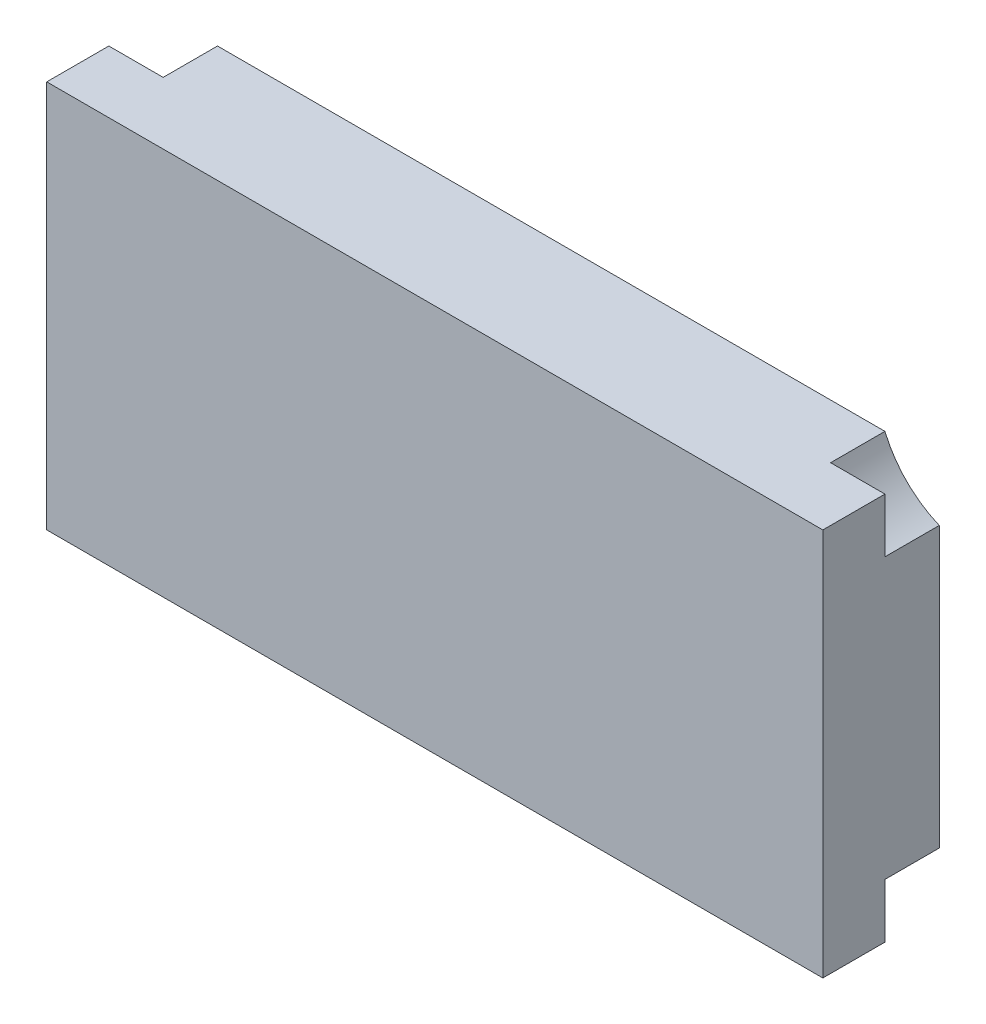
ISO-10303-21;
HEADER;
FILE_DESCRIPTION(('STEP AP214'),'2;1');
FILE_NAME('part.step','',(''),(''),'','','');
FILE_SCHEMA(('AUTOMOTIVE_DESIGN { 1 0 10303 214 1 1 1 1 }'));
ENDSEC;
DATA;
#1=APPLICATION_CONTEXT('core data for automotive mechanical design processes');
#2=APPLICATION_PROTOCOL_DEFINITION('international standard','automotive_design',2000,#1);
#3=PRODUCT_CONTEXT('',#1,'mechanical');
#4=PRODUCT('Part','Part','',(#3));
#5=PRODUCT_RELATED_PRODUCT_CATEGORY('part','',(#4));
#6=PRODUCT_DEFINITION_FORMATION('','',#4);
#7=PRODUCT_DEFINITION_CONTEXT('part definition',#1,'design');
#8=PRODUCT_DEFINITION('design','',#6,#7);
#9=PRODUCT_DEFINITION_SHAPE('','',#8);
#10=(LENGTH_UNIT() NAMED_UNIT(*) SI_UNIT(.MILLI.,.METRE.));
#11=(NAMED_UNIT(*) PLANE_ANGLE_UNIT() SI_UNIT($,.RADIAN.));
#12=(NAMED_UNIT(*) SI_UNIT($,.STERADIAN.) SOLID_ANGLE_UNIT());
#13=UNCERTAINTY_MEASURE_WITH_UNIT(LENGTH_MEASURE(1.E-05),#10,'distance_accuracy_value','');
#14=(GEOMETRIC_REPRESENTATION_CONTEXT(3) GLOBAL_UNCERTAINTY_ASSIGNED_CONTEXT((#13)) GLOBAL_UNIT_ASSIGNED_CONTEXT((#10,
#11,#12)) REPRESENTATION_CONTEXT('',''));
#15=CARTESIAN_POINT('',(0.,0.,0.));
#16=DIRECTION('',(0.,0.,1.));
#17=DIRECTION('',(1.,0.,0.));
#18=AXIS2_PLACEMENT_3D('',#15,#16,#17);
#19=CARTESIAN_POINT('',(-0.55,-0.3,0.07));
#20=DIRECTION('',(0.,0.,-1.));
#21=DIRECTION('',(-1.,0.,0.));
#22=AXIS2_PLACEMENT_3D('',#19,#20,#21);
#23=CYLINDRICAL_SURFACE('',#22,0.13);
#24=CARTESIAN_POINT('',(-0.55,-0.3,0.));
#25=DIRECTION('',(0.,0.,-1.));
#26=DIRECTION('',(-1.,0.,0.));
#27=AXIS2_PLACEMENT_3D('',#24,#25,#26);
#28=CIRCLE('',#27,0.13);
#29=CARTESIAN_POINT('',(-0.5,-0.179999999994,0.));
#30=VERTEX_POINT('',#29);
#31=CARTESIAN_POINT('',(-0.43,-0.25,0.));
#32=VERTEX_POINT('',#31);
#33=EDGE_CURVE('E142',#30,#32,#28,.T.);
#34=ORIENTED_EDGE('',*,*,#33,.T.);
#35=DIRECTION('',(0.,0.,1.));
#36=VECTOR('',#35,1.);
#37=CARTESIAN_POINT('',(-0.43,-0.25,0.));
#38=LINE('',#37,#36);
#39=CARTESIAN_POINT('',(-0.43,-0.25,0.0700000000125));
#40=VERTEX_POINT('',#39);
#41=EDGE_CURVE('E110',#32,#40,#38,.T.);
#42=ORIENTED_EDGE('',*,*,#41,.T.);
#43=CARTESIAN_POINT('',(-0.55,-0.3,0.07));
#44=DIRECTION('',(0.,0.,-1.));
#45=DIRECTION('',(-1.,0.,0.));
#46=AXIS2_PLACEMENT_3D('',#43,#44,#45);
#47=CIRCLE('',#46,0.13);
#48=CARTESIAN_POINT('',(-0.5,-0.179999999994,0.070000000025));
#49=VERTEX_POINT('',#48);
#50=EDGE_CURVE('E20',#49,#40,#47,.T.);
#51=ORIENTED_EDGE('',*,*,#50,.F.);
#52=DIRECTION('',(0.,0.,-1.));
#53=VECTOR('',#52,1.);
#54=CARTESIAN_POINT('',(-0.5,-0.179999999988,0.));
#55=LINE('',#54,#53);
#56=EDGE_CURVE('E107',#49,#30,#55,.T.);
#57=ORIENTED_EDGE('',*,*,#56,.T.);
#58=EDGE_LOOP('',(#34,#42,#51,#57));
#59=FACE_BOUND('',#58,.T.);
#60=ADVANCED_FACE('F17',(#59),#23,.F.);
#61=CARTESIAN_POINT('',(-0.42958,-0.25,0.07));
#62=DIRECTION('',(0.,0.,-1.));
#63=DIRECTION('',(-1.,0.,0.));
#64=AXIS2_PLACEMENT_3D('',#61,#62,#63);
#65=PLANE('',#64);
#66=DIRECTION('',(0.,1.,0.));
#67=VECTOR('',#66,1.);
#68=CARTESIAN_POINT('',(-0.5,-0.25,0.07000000005));
#69=LINE('',#68,#67);
#70=CARTESIAN_POINT('',(-0.5,-0.25,0.0700000000291667));
#71=VERTEX_POINT('',#70);
#72=EDGE_CURVE('E115',#71,#49,#69,.T.);
#73=ORIENTED_EDGE('',*,*,#72,.T.);
#74=ORIENTED_EDGE('',*,*,#50,.T.);
#75=DIRECTION('',(1.,0.,0.));
#76=VECTOR('',#75,1.);
#77=CARTESIAN_POINT('',(-0.5,-0.25,0.070000000025));
#78=LINE('',#77,#76);
#79=EDGE_CURVE('E117',#40,#71,#78,.F.);
#80=ORIENTED_EDGE('',*,*,#79,.T.);
#81=EDGE_LOOP('',(#73,#74,#80));
#82=FACE_BOUND('',#81,.T.);
#83=ADVANCED_FACE('F116',(#82),#65,.T.);
#84=CARTESIAN_POINT('',(0.5,-0.25,0.07));
#85=DIRECTION('',(0.,0.,-1.));
#86=DIRECTION('',(-1.,0.,0.));
#87=AXIS2_PLACEMENT_3D('',#84,#85,#86);
#88=PLANE('',#87);
#89=CARTESIAN_POINT('',(0.55,-0.3,0.07));
#90=DIRECTION('',(0.,0.,-1.));
#91=DIRECTION('',(-1.,0.,0.));
#92=AXIS2_PLACEMENT_3D('',#89,#90,#91);
#93=CIRCLE('',#92,0.13);
#94=CARTESIAN_POINT('',(0.430000000004,-0.25,0.0700000000125));
#95=VERTEX_POINT('',#94);
#96=CARTESIAN_POINT('',(0.5,-0.18,0.0700000000125));
#97=VERTEX_POINT('',#96);
#98=EDGE_CURVE('E113',#95,#97,#93,.T.);
#99=ORIENTED_EDGE('',*,*,#98,.T.);
#100=DIRECTION('',(0.,1.,0.));
#101=VECTOR('',#100,1.);
#102=CARTESIAN_POINT('',(0.5,-0.25,0.070000000025));
#103=LINE('',#102,#101);
#104=CARTESIAN_POINT('',(0.5,-0.25,0.0700000000208333));
#105=VERTEX_POINT('',#104);
#106=EDGE_CURVE('E152',#97,#105,#103,.F.);
#107=ORIENTED_EDGE('',*,*,#106,.T.);
#108=DIRECTION('',(1.,0.,0.));
#109=VECTOR('',#108,1.);
#110=CARTESIAN_POINT('',(-0.5,-0.25,0.070000000025));
#111=LINE('',#110,#109);
#112=EDGE_CURVE('E154',#105,#95,#111,.F.);
#113=ORIENTED_EDGE('',*,*,#112,.T.);
#114=EDGE_LOOP('',(#99,#107,#113));
#115=FACE_BOUND('',#114,.T.);
#116=ADVANCED_FACE('F150',(#115),#88,.T.);
#117=CARTESIAN_POINT('',(0.55,-0.3,0.07));
#118=DIRECTION('',(0.,0.,-1.));
#119=DIRECTION('',(-1.,0.,0.));
#120=AXIS2_PLACEMENT_3D('',#117,#118,#119);
#121=CYLINDRICAL_SURFACE('',#120,0.13);
#122=CARTESIAN_POINT('',(0.55,-0.3,0.));
#123=DIRECTION('',(0.,0.,-1.));
#124=DIRECTION('',(-1.,0.,0.));
#125=AXIS2_PLACEMENT_3D('',#122,#123,#124);
#126=CIRCLE('',#125,0.13);
#127=CARTESIAN_POINT('',(0.430000000004,-0.25,0.));
#128=VERTEX_POINT('',#127);
#129=CARTESIAN_POINT('',(0.5,-0.18,0.));
#130=VERTEX_POINT('',#129);
#131=EDGE_CURVE('E140',#128,#130,#126,.T.);
#132=ORIENTED_EDGE('',*,*,#131,.T.);
#133=DIRECTION('',(0.,0.,1.));
#134=VECTOR('',#133,1.);
#135=CARTESIAN_POINT('',(0.5,-0.18,0.));
#136=LINE('',#135,#134);
#137=EDGE_CURVE('E159',#130,#97,#136,.T.);
#138=ORIENTED_EDGE('',*,*,#137,.T.);
#139=ORIENTED_EDGE('',*,*,#98,.F.);
#140=DIRECTION('',(0.,0.,1.));
#141=VECTOR('',#140,1.);
#142=CARTESIAN_POINT('',(0.430000000008,-0.25,0.));
#143=LINE('',#142,#141);
#144=EDGE_CURVE('E169',#95,#128,#143,.F.);
#145=ORIENTED_EDGE('',*,*,#144,.T.);
#146=EDGE_LOOP('',(#132,#138,#139,#145));
#147=FACE_BOUND('',#146,.T.);
#148=ADVANCED_FACE('F160',(#147),#121,.F.);
#149=CARTESIAN_POINT('',(0.5,0.17958,0.07));
#150=DIRECTION('',(0.,0.,-1.));
#151=DIRECTION('',(-1.,0.,0.));
#152=AXIS2_PLACEMENT_3D('',#149,#150,#151);
#153=PLANE('',#152);
#154=DIRECTION('',(0.,1.,0.));
#155=VECTOR('',#154,1.);
#156=CARTESIAN_POINT('',(0.5,-0.25,0.070000000025));
#157=LINE('',#156,#155);
#158=CARTESIAN_POINT('',(0.5,0.249999999995167,0.0700000000083334));
#159=VERTEX_POINT('',#158);
#160=CARTESIAN_POINT('',(0.5,0.18,0.070000000025));
#161=VERTEX_POINT('',#160);
#162=EDGE_CURVE('E171',#159,#161,#157,.F.);
#163=ORIENTED_EDGE('',*,*,#162,.T.);
#164=CARTESIAN_POINT('',(0.55,0.3,0.070000000025));
#165=DIRECTION('',(0.,0.,-1.));
#166=DIRECTION('',(-1.,0.,0.));
#167=AXIS2_PLACEMENT_3D('',#164,#165,#166);
#168=CIRCLE('',#167,0.13);
#169=CARTESIAN_POINT('',(0.430000000006,0.25,0.0700000000125));
#170=VERTEX_POINT('',#169);
#171=EDGE_CURVE('E138',#161,#170,#168,.T.);
#172=ORIENTED_EDGE('',*,*,#171,.T.);
#173=DIRECTION('',(1.,0.,0.));
#174=VECTOR('',#173,1.);
#175=CARTESIAN_POINT('',(-0.5,0.25,0.07));
#176=LINE('',#175,#174);
#177=EDGE_CURVE('E163',#170,#159,#176,.T.);
#178=ORIENTED_EDGE('',*,*,#177,.T.);
#179=EDGE_LOOP('',(#163,#172,#178));
#180=FACE_BOUND('',#179,.T.);
#181=ADVANCED_FACE('F239',(#180),#153,.T.);
#182=CARTESIAN_POINT('',(-0.42958,0.17958,0.07));
#183=DIRECTION('',(0.,0.,-1.));
#184=DIRECTION('',(-1.,0.,0.));
#185=AXIS2_PLACEMENT_3D('',#182,#183,#184);
#186=PLANE('',#185);
#187=DIRECTION('',(1.,0.,0.));
#188=VECTOR('',#187,1.);
#189=CARTESIAN_POINT('',(-0.5,0.25,0.07000000004167));
#190=LINE('',#189,#188);
#191=CARTESIAN_POINT('',(-0.5,0.25,0.0700000000291683));
#192=VERTEX_POINT('',#191);
#193=CARTESIAN_POINT('',(-0.43,0.25,0.070000000033335));
#194=VERTEX_POINT('',#193);
#195=EDGE_CURVE('E248',#192,#194,#190,.T.);
#196=ORIENTED_EDGE('',*,*,#195,.T.);
#197=CARTESIAN_POINT('',(-0.55,0.3,0.070000000025));
#198=DIRECTION('',(0.,0.,-1.));
#199=DIRECTION('',(-1.,0.,0.));
#200=AXIS2_PLACEMENT_3D('',#197,#198,#199);
#201=CIRCLE('',#200,0.13);
#202=CARTESIAN_POINT('',(-0.5,0.18,0.070000000025));
#203=VERTEX_POINT('',#202);
#204=EDGE_CURVE('E146',#194,#203,#201,.T.);
#205=ORIENTED_EDGE('',*,*,#204,.T.);
#206=DIRECTION('',(0.,1.,0.));
#207=VECTOR('',#206,1.);
#208=CARTESIAN_POINT('',(-0.5,-0.25,0.070000000025));
#209=LINE('',#208,#207);
#210=EDGE_CURVE('E120',#203,#192,#209,.T.);
#211=ORIENTED_EDGE('',*,*,#210,.T.);
#212=EDGE_LOOP('',(#196,#205,#211));
#213=FACE_BOUND('',#212,.T.);
#214=ADVANCED_FACE('F257',(#213),#186,.T.);
#215=CARTESIAN_POINT('',(-0.55,0.3,0.07));
#216=DIRECTION('',(0.,0.,-1.));
#217=DIRECTION('',(-1.,0.,0.));
#218=AXIS2_PLACEMENT_3D('',#215,#216,#217);
#219=CYLINDRICAL_SURFACE('',#218,0.13);
#220=CARTESIAN_POINT('',(-0.55,0.3,0.));
#221=DIRECTION('',(0.,0.,-1.));
#222=DIRECTION('',(-1.,0.,0.));
#223=AXIS2_PLACEMENT_3D('',#220,#221,#222);
#224=CIRCLE('',#223,0.13);
#225=CARTESIAN_POINT('',(-0.43,0.25,0.));
#226=VERTEX_POINT('',#225);
#227=CARTESIAN_POINT('',(-0.5,0.18,0.));
#228=VERTEX_POINT('',#227);
#229=EDGE_CURVE('E144',#226,#228,#224,.T.);
#230=ORIENTED_EDGE('',*,*,#229,.T.);
#231=DIRECTION('',(0.,0.,-1.));
#232=VECTOR('',#231,1.);
#233=CARTESIAN_POINT('',(-0.5,0.18,0.));
#234=LINE('',#233,#232);
#235=EDGE_CURVE('E132',#228,#203,#234,.F.);
#236=ORIENTED_EDGE('',*,*,#235,.T.);
#237=ORIENTED_EDGE('',*,*,#204,.F.);
#238=DIRECTION('',(0.,0.,-1.));
#239=VECTOR('',#238,1.);
#240=CARTESIAN_POINT('',(-0.43,0.25,0.15));
#241=LINE('',#240,#239);
#242=EDGE_CURVE('E246',#194,#226,#241,.T.);
#243=ORIENTED_EDGE('',*,*,#242,.T.);
#244=EDGE_LOOP('',(#230,#236,#237,#243));
#245=FACE_BOUND('',#244,.T.);
#246=ADVANCED_FACE('F262',(#245),#219,.F.);
#247=CARTESIAN_POINT('',(-0.5,-0.25,0.));
#248=DIRECTION('',(0.,0.,1.));
#249=DIRECTION('',(1.,0.,0.));
#250=AXIS2_PLACEMENT_3D('',#247,#248,#249);
#251=PLANE('',#250);
#252=DIRECTION('',(1.,0.,0.));
#253=VECTOR('',#252,1.);
#254=CARTESIAN_POINT('',(-0.5,-0.25,0.));
#255=LINE('',#254,#253);
#256=EDGE_CURVE('E126',#128,#32,#255,.F.);
#257=ORIENTED_EDGE('',*,*,#256,.T.);
#258=ORIENTED_EDGE('',*,*,#33,.F.);
#259=DIRECTION('',(0.,1.,0.));
#260=VECTOR('',#259,1.);
#261=CARTESIAN_POINT('',(-0.5,-0.25,0.));
#262=LINE('',#261,#260);
#263=EDGE_CURVE('E125',#30,#228,#262,.T.);
#264=ORIENTED_EDGE('',*,*,#263,.T.);
#265=ORIENTED_EDGE('',*,*,#229,.F.);
#266=DIRECTION('',(1.,0.,0.));
#267=VECTOR('',#266,1.);
#268=CARTESIAN_POINT('',(-0.5,0.25,0.));
#269=LINE('',#268,#267);
#270=CARTESIAN_POINT('',(0.430000000006,0.25,0.));
#271=VERTEX_POINT('',#270);
#272=EDGE_CURVE('E207',#226,#271,#269,.T.);
#273=ORIENTED_EDGE('',*,*,#272,.T.);
#274=CARTESIAN_POINT('',(0.55,0.3,0.));
#275=DIRECTION('',(0.,0.,-1.));
#276=DIRECTION('',(-1.,0.,0.));
#277=AXIS2_PLACEMENT_3D('',#274,#275,#276);
#278=CIRCLE('',#277,0.13);
#279=CARTESIAN_POINT('',(0.5,0.18,0.));
#280=VERTEX_POINT('',#279);
#281=EDGE_CURVE('E136',#271,#280,#278,.F.);
#282=ORIENTED_EDGE('',*,*,#281,.T.);
#283=DIRECTION('',(0.,1.,0.));
#284=VECTOR('',#283,1.);
#285=CARTESIAN_POINT('',(0.5,-0.25,0.));
#286=LINE('',#285,#284);
#287=EDGE_CURVE('E164',#280,#130,#286,.F.);
#288=ORIENTED_EDGE('',*,*,#287,.T.);
#289=ORIENTED_EDGE('',*,*,#131,.F.);
#290=EDGE_LOOP('',(#257,#258,#264,#265,#273,#282,#288,#289));
#291=FACE_BOUND('',#290,.T.);
#292=ADVANCED_FACE('F230',(#291),#251,.F.);
#293=CARTESIAN_POINT('',(0.55,0.3,0.07));
#294=DIRECTION('',(0.,0.,-1.));
#295=DIRECTION('',(-1.,0.,0.));
#296=AXIS2_PLACEMENT_3D('',#293,#294,#295);
#297=CYLINDRICAL_SURFACE('',#296,0.13);
#298=ORIENTED_EDGE('',*,*,#281,.F.);
#299=DIRECTION('',(0.,0.,-1.));
#300=VECTOR('',#299,1.);
#301=CARTESIAN_POINT('',(0.430000000012,0.25,0.15));
#302=LINE('',#301,#300);
#303=EDGE_CURVE('E204',#271,#170,#302,.F.);
#304=ORIENTED_EDGE('',*,*,#303,.T.);
#305=ORIENTED_EDGE('',*,*,#171,.F.);
#306=DIRECTION('',(0.,0.,1.));
#307=VECTOR('',#306,1.);
#308=CARTESIAN_POINT('',(0.5,0.18,0.));
#309=LINE('',#308,#307);
#310=EDGE_CURVE('E221',#161,#280,#309,.F.);
#311=ORIENTED_EDGE('',*,*,#310,.T.);
#312=EDGE_LOOP('',(#298,#304,#305,#311));
#313=FACE_BOUND('',#312,.T.);
#314=ADVANCED_FACE('F235',(#313),#297,.F.);
#315=CARTESIAN_POINT('',(-0.5,-0.25,0.));
#316=DIRECTION('',(1.,0.,0.));
#317=DIRECTION('',(0.,0.,-1.));
#318=AXIS2_PLACEMENT_3D('',#315,#316,#317);
#319=PLANE('',#318);
#320=ORIENTED_EDGE('',*,*,#72,.F.);
#321=DIRECTION('',(0.,0.,1.));
#322=VECTOR('',#321,1.);
#323=CARTESIAN_POINT('',(-0.5,-0.25,0.));
#324=LINE('',#323,#322);
#325=CARTESIAN_POINT('',(-0.5,-0.25,0.15));
#326=VERTEX_POINT('',#325);
#327=EDGE_CURVE('E179',#71,#326,#324,.T.);
#328=ORIENTED_EDGE('',*,*,#327,.T.);
#329=DIRECTION('',(0.,1.,0.));
#330=VECTOR('',#329,1.);
#331=CARTESIAN_POINT('',(-0.5,-0.25,0.15));
#332=LINE('',#331,#330);
#333=CARTESIAN_POINT('',(-0.5,0.25,0.15));
#334=VERTEX_POINT('',#333);
#335=EDGE_CURVE('E194',#334,#326,#332,.F.);
#336=ORIENTED_EDGE('',*,*,#335,.F.);
#337=DIRECTION('',(0.,0.,-1.));
#338=VECTOR('',#337,1.);
#339=CARTESIAN_POINT('',(-0.5,0.25,0.15));
#340=LINE('',#339,#338);
#341=EDGE_CURVE('E225',#334,#192,#340,.T.);
#342=ORIENTED_EDGE('',*,*,#341,.T.);
#343=ORIENTED_EDGE('',*,*,#210,.F.);
#344=ORIENTED_EDGE('',*,*,#235,.F.);
#345=ORIENTED_EDGE('',*,*,#263,.F.);
#346=ORIENTED_EDGE('',*,*,#56,.F.);
#347=EDGE_LOOP('',(#320,#328,#336,#342,#343,#344,#345,#346));
#348=FACE_BOUND('',#347,.T.);
#349=ADVANCED_FACE('F122',(#348),#319,.F.);
#350=CARTESIAN_POINT('',(-0.5,-0.25,0.));
#351=DIRECTION('',(0.,1.,0.));
#352=DIRECTION('',(0.,0.,1.));
#353=AXIS2_PLACEMENT_3D('',#350,#351,#352);
#354=PLANE('',#353);
#355=ORIENTED_EDGE('',*,*,#112,.F.);
#356=DIRECTION('',(0.,0.,1.));
#357=VECTOR('',#356,1.);
#358=CARTESIAN_POINT('',(0.5,-0.25,0.));
#359=LINE('',#358,#357);
#360=CARTESIAN_POINT('',(0.5,-0.25,0.15));
#361=VERTEX_POINT('',#360);
#362=EDGE_CURVE('E168',#105,#361,#359,.T.);
#363=ORIENTED_EDGE('',*,*,#362,.T.);
#364=DIRECTION('',(1.,0.,0.));
#365=VECTOR('',#364,1.);
#366=CARTESIAN_POINT('',(-0.5,-0.25,0.15));
#367=LINE('',#366,#365);
#368=EDGE_CURVE('E198',#326,#361,#367,.T.);
#369=ORIENTED_EDGE('',*,*,#368,.F.);
#370=ORIENTED_EDGE('',*,*,#327,.F.);
#371=ORIENTED_EDGE('',*,*,#79,.F.);
#372=ORIENTED_EDGE('',*,*,#41,.F.);
#373=ORIENTED_EDGE('',*,*,#256,.F.);
#374=ORIENTED_EDGE('',*,*,#144,.F.);
#375=EDGE_LOOP('',(#355,#363,#369,#370,#371,#372,#373,#374));
#376=FACE_BOUND('',#375,.T.);
#377=ADVANCED_FACE('F199',(#376),#354,.F.);
#378=CARTESIAN_POINT('',(0.5,-0.25,0.));
#379=DIRECTION('',(-1.,0.,0.));
#380=DIRECTION('',(0.,0.,1.));
#381=AXIS2_PLACEMENT_3D('',#378,#379,#380);
#382=PLANE('',#381);
#383=ORIENTED_EDGE('',*,*,#287,.F.);
#384=ORIENTED_EDGE('',*,*,#310,.F.);
#385=ORIENTED_EDGE('',*,*,#162,.F.);
#386=DIRECTION('',(0.,0.,-1.));
#387=VECTOR('',#386,1.);
#388=CARTESIAN_POINT('',(0.5,0.25,0.15));
#389=LINE('',#388,#387);
#390=CARTESIAN_POINT('',(0.5,0.25,0.15));
#391=VERTEX_POINT('',#390);
#392=EDGE_CURVE('E35',#159,#391,#389,.F.);
#393=ORIENTED_EDGE('',*,*,#392,.T.);
#394=DIRECTION('',(0.,1.,0.));
#395=VECTOR('',#394,1.);
#396=CARTESIAN_POINT('',(0.5,-0.25,0.15));
#397=LINE('',#396,#395);
#398=EDGE_CURVE('E26',#361,#391,#397,.T.);
#399=ORIENTED_EDGE('',*,*,#398,.F.);
#400=ORIENTED_EDGE('',*,*,#362,.F.);
#401=ORIENTED_EDGE('',*,*,#106,.F.);
#402=ORIENTED_EDGE('',*,*,#137,.F.);
#403=EDGE_LOOP('',(#383,#384,#385,#393,#399,#400,#401,#402));
#404=FACE_BOUND('',#403,.T.);
#405=ADVANCED_FACE('F167',(#404),#382,.F.);
#406=CARTESIAN_POINT('',(-0.5,0.25,0.15));
#407=DIRECTION('',(0.,-1.,0.));
#408=DIRECTION('',(0.,0.,-1.));
#409=AXIS2_PLACEMENT_3D('',#406,#407,#408);
#410=PLANE('',#409);
#411=ORIENTED_EDGE('',*,*,#272,.F.);
#412=ORIENTED_EDGE('',*,*,#242,.F.);
#413=ORIENTED_EDGE('',*,*,#195,.F.);
#414=ORIENTED_EDGE('',*,*,#341,.F.);
#415=DIRECTION('',(1.,0.,0.));
#416=VECTOR('',#415,1.);
#417=CARTESIAN_POINT('',(-0.5,0.25,0.15));
#418=LINE('',#417,#416);
#419=EDGE_CURVE('E11',#391,#334,#418,.F.);
#420=ORIENTED_EDGE('',*,*,#419,.F.);
#421=ORIENTED_EDGE('',*,*,#392,.F.);
#422=ORIENTED_EDGE('',*,*,#177,.F.);
#423=ORIENTED_EDGE('',*,*,#303,.F.);
#424=EDGE_LOOP('',(#411,#412,#413,#414,#420,#421,#422,#423));
#425=FACE_BOUND('',#424,.T.);
#426=ADVANCED_FACE('F242',(#425),#410,.F.);
#427=CARTESIAN_POINT('',(-0.5,-0.25,0.15));
#428=DIRECTION('',(0.,0.,1.));
#429=DIRECTION('',(1.,0.,0.));
#430=AXIS2_PLACEMENT_3D('',#427,#428,#429);
#431=PLANE('',#430);
#432=ORIENTED_EDGE('',*,*,#398,.T.);
#433=ORIENTED_EDGE('',*,*,#419,.T.);
#434=ORIENTED_EDGE('',*,*,#335,.T.);
#435=ORIENTED_EDGE('',*,*,#368,.T.);
#436=EDGE_LOOP('',(#432,#433,#434,#435));
#437=FACE_BOUND('',#436,.T.);
#438=ADVANCED_FACE('F203',(#437),#431,.T.);
#439=CLOSED_SHELL('',(#60,#83,#116,#148,#181,#214,#246,#292,#314,#349,#377,#405,#426,#438));
#440=MANIFOLD_SOLID_BREP('B1',#439);
#441=ADVANCED_BREP_SHAPE_REPRESENTATION('',(#18,#440),#14);
#442=SHAPE_DEFINITION_REPRESENTATION(#9,#441);
ENDSEC;
END-ISO-10303-21;
